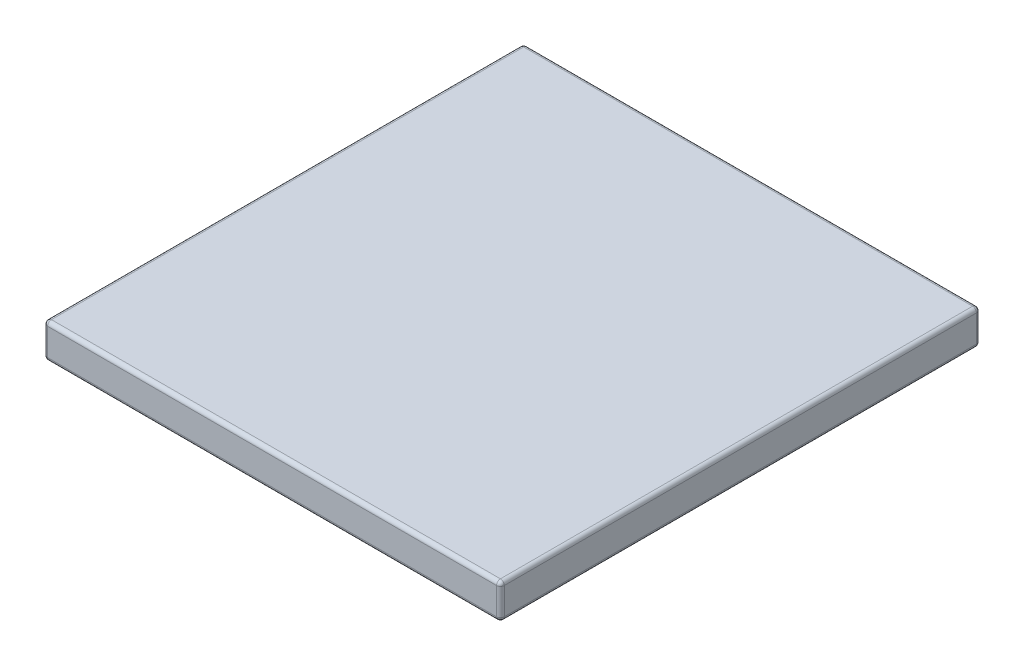
ISO-10303-21;
HEADER;
FILE_DESCRIPTION(('STEP AP214'),'2;1');
FILE_NAME('part.step','',(''),(''),'','','');
FILE_SCHEMA(('AUTOMOTIVE_DESIGN { 1 0 10303 214 1 1 1 1 }'));
ENDSEC;
DATA;
#1=APPLICATION_CONTEXT('core data for automotive mechanical design processes');
#2=APPLICATION_PROTOCOL_DEFINITION('international standard','automotive_design',2000,#1);
#3=PRODUCT_CONTEXT('',#1,'mechanical');
#4=PRODUCT('Part','Part','',(#3));
#5=PRODUCT_RELATED_PRODUCT_CATEGORY('part','',(#4));
#6=PRODUCT_DEFINITION_FORMATION('','',#4);
#7=PRODUCT_DEFINITION_CONTEXT('part definition',#1,'design');
#8=PRODUCT_DEFINITION('design','',#6,#7);
#9=PRODUCT_DEFINITION_SHAPE('','',#8);
#10=(LENGTH_UNIT() NAMED_UNIT(*) SI_UNIT(.MILLI.,.METRE.));
#11=(NAMED_UNIT(*) PLANE_ANGLE_UNIT() SI_UNIT($,.RADIAN.));
#12=(NAMED_UNIT(*) SI_UNIT($,.STERADIAN.) SOLID_ANGLE_UNIT());
#13=UNCERTAINTY_MEASURE_WITH_UNIT(LENGTH_MEASURE(1.E-05),#10,'distance_accuracy_value','');
#14=(GEOMETRIC_REPRESENTATION_CONTEXT(3) GLOBAL_UNCERTAINTY_ASSIGNED_CONTEXT((#13)) GLOBAL_UNIT_ASSIGNED_CONTEXT((#10,
#11,#12)) REPRESENTATION_CONTEXT('',''));
#15=CARTESIAN_POINT('',(0.,0.,0.));
#16=DIRECTION('',(0.,0.,1.));
#17=DIRECTION('',(1.,0.,0.));
#18=AXIS2_PLACEMENT_3D('',#15,#16,#17);
#19=CARTESIAN_POINT('',(-29.55,-4.5,-31.05));
#20=DIRECTION('',(-1.,0.,0.));
#21=DIRECTION('',(0.,0.,1.));
#22=AXIS2_PLACEMENT_3D('',#19,#20,#21);
#23=PLANE('',#22);
#24=DIRECTION('',(0.,1.,0.));
#25=VECTOR('',#24,1.);
#26=CARTESIAN_POINT('',(-29.55,-4.5,-30.55));
#27=LINE('',#26,#25);
#28=CARTESIAN_POINT('',(-29.55,-0.5,-30.55));
#29=VERTEX_POINT('',#28);
#30=CARTESIAN_POINT('',(-29.55,-4.,-30.55));
#31=VERTEX_POINT('',#30);
#32=EDGE_CURVE('E149',#29,#31,#27,.F.);
#33=ORIENTED_EDGE('',*,*,#32,.T.);
#34=DIRECTION('',(0.,0.,1.));
#35=VECTOR('',#34,1.);
#36=CARTESIAN_POINT('',(-29.55,-4.,31.05));
#37=LINE('',#36,#35);
#38=CARTESIAN_POINT('',(-29.55,-4.,30.55));
#39=VERTEX_POINT('',#38);
#40=EDGE_CURVE('E152',#31,#39,#37,.T.);
#41=ORIENTED_EDGE('',*,*,#40,.T.);
#42=DIRECTION('',(0.,1.,0.));
#43=VECTOR('',#42,1.);
#44=CARTESIAN_POINT('',(-29.55,-4.5,30.55));
#45=LINE('',#44,#43);
#46=CARTESIAN_POINT('',(-29.55,-0.5,30.55));
#47=VERTEX_POINT('',#46);
#48=EDGE_CURVE('E126',#39,#47,#45,.T.);
#49=ORIENTED_EDGE('',*,*,#48,.T.);
#50=DIRECTION('',(0.,0.,1.));
#51=VECTOR('',#50,1.);
#52=CARTESIAN_POINT('',(-29.55,-0.5,-31.05));
#53=LINE('',#52,#51);
#54=EDGE_CURVE('E143',#47,#29,#53,.F.);
#55=ORIENTED_EDGE('',*,*,#54,.T.);
#56=EDGE_LOOP('',(#33,#41,#49,#55));
#57=FACE_BOUND('',#56,.T.);
#58=ADVANCED_FACE('F33',(#57),#23,.T.);
#59=CARTESIAN_POINT('',(-29.55,-4.5,-31.05));
#60=DIRECTION('',(0.,0.,-1.));
#61=DIRECTION('',(-1.,0.,0.));
#62=AXIS2_PLACEMENT_3D('',#59,#60,#61);
#63=PLANE('',#62);
#64=DIRECTION('',(0.,1.,0.));
#65=VECTOR('',#64,1.);
#66=CARTESIAN_POINT('',(29.05,-4.5,-31.05));
#67=LINE('',#66,#65);
#68=CARTESIAN_POINT('',(29.05,-0.5,-31.05));
#69=VERTEX_POINT('',#68);
#70=CARTESIAN_POINT('',(29.05,-4.,-31.05));
#71=VERTEX_POINT('',#70);
#72=EDGE_CURVE('E167',#69,#71,#67,.F.);
#73=ORIENTED_EDGE('',*,*,#72,.T.);
#74=DIRECTION('',(-1.,0.,0.));
#75=VECTOR('',#74,1.);
#76=CARTESIAN_POINT('',(-29.55,-4.,-31.05));
#77=LINE('',#76,#75);
#78=CARTESIAN_POINT('',(-29.05,-4.,-31.05));
#79=VERTEX_POINT('',#78);
#80=EDGE_CURVE('E172',#71,#79,#77,.T.);
#81=ORIENTED_EDGE('',*,*,#80,.T.);
#82=DIRECTION('',(0.,1.,0.));
#83=VECTOR('',#82,1.);
#84=CARTESIAN_POINT('',(-29.05,-4.5,-31.05));
#85=LINE('',#84,#83);
#86=CARTESIAN_POINT('',(-29.05,-0.5,-31.05));
#87=VERTEX_POINT('',#86);
#88=EDGE_CURVE('E169',#79,#87,#85,.T.);
#89=ORIENTED_EDGE('',*,*,#88,.T.);
#90=DIRECTION('',(-1.,0.,0.));
#91=VECTOR('',#90,1.);
#92=CARTESIAN_POINT('',(-29.55,-0.5,-31.05));
#93=LINE('',#92,#91);
#94=EDGE_CURVE('E165',#87,#69,#93,.F.);
#95=ORIENTED_EDGE('',*,*,#94,.T.);
#96=EDGE_LOOP('',(#73,#81,#89,#95));
#97=FACE_BOUND('',#96,.T.);
#98=ADVANCED_FACE('F278',(#97),#63,.T.);
#99=CARTESIAN_POINT('',(29.55,-4.5,-31.05));
#100=DIRECTION('',(1.,0.,0.));
#101=DIRECTION('',(0.,0.,-1.));
#102=AXIS2_PLACEMENT_3D('',#99,#100,#101);
#103=PLANE('',#102);
#104=DIRECTION('',(0.,1.,0.));
#105=VECTOR('',#104,1.);
#106=CARTESIAN_POINT('',(29.55,-4.5,30.55));
#107=LINE('',#106,#105);
#108=CARTESIAN_POINT('',(29.55,-0.5,30.55));
#109=VERTEX_POINT('',#108);
#110=CARTESIAN_POINT('',(29.55,-4.,30.55));
#111=VERTEX_POINT('',#110);
#112=EDGE_CURVE('E176',#109,#111,#107,.F.);
#113=ORIENTED_EDGE('',*,*,#112,.T.);
#114=DIRECTION('',(0.,0.,-1.));
#115=VECTOR('',#114,1.);
#116=CARTESIAN_POINT('',(29.55,-4.,-31.05));
#117=LINE('',#116,#115);
#118=CARTESIAN_POINT('',(29.55,-4.,-30.55));
#119=VERTEX_POINT('',#118);
#120=EDGE_CURVE('E181',#111,#119,#117,.T.);
#121=ORIENTED_EDGE('',*,*,#120,.T.);
#122=DIRECTION('',(0.,1.,0.));
#123=VECTOR('',#122,1.);
#124=CARTESIAN_POINT('',(29.55,-4.5,-30.55));
#125=LINE('',#124,#123);
#126=CARTESIAN_POINT('',(29.55,-0.5,-30.55));
#127=VERTEX_POINT('',#126);
#128=EDGE_CURVE('E178',#119,#127,#125,.T.);
#129=ORIENTED_EDGE('',*,*,#128,.T.);
#130=DIRECTION('',(0.,0.,-1.));
#131=VECTOR('',#130,1.);
#132=CARTESIAN_POINT('',(29.55,-0.5,-31.05));
#133=LINE('',#132,#131);
#134=EDGE_CURVE('E174',#127,#109,#133,.F.);
#135=ORIENTED_EDGE('',*,*,#134,.T.);
#136=EDGE_LOOP('',(#113,#121,#129,#135));
#137=FACE_BOUND('',#136,.T.);
#138=ADVANCED_FACE('F291',(#137),#103,.T.);
#139=CARTESIAN_POINT('',(-29.55,-4.5,31.05));
#140=DIRECTION('',(0.,0.,1.));
#141=DIRECTION('',(1.,0.,0.));
#142=AXIS2_PLACEMENT_3D('',#139,#140,#141);
#143=PLANE('',#142);
#144=DIRECTION('',(0.,1.,0.));
#145=VECTOR('',#144,1.);
#146=CARTESIAN_POINT('',(-29.05,-4.5,31.05));
#147=LINE('',#146,#145);
#148=CARTESIAN_POINT('',(-29.05,-0.5,31.05));
#149=VERTEX_POINT('',#148);
#150=CARTESIAN_POINT('',(-29.05,-4.,31.05));
#151=VERTEX_POINT('',#150);
#152=EDGE_CURVE('E128',#149,#151,#147,.F.);
#153=ORIENTED_EDGE('',*,*,#152,.T.);
#154=DIRECTION('',(1.,0.,0.));
#155=VECTOR('',#154,1.);
#156=CARTESIAN_POINT('',(29.55,-4.,31.05));
#157=LINE('',#156,#155);
#158=CARTESIAN_POINT('',(29.05,-4.,31.05));
#159=VERTEX_POINT('',#158);
#160=EDGE_CURVE('E163',#151,#159,#157,.T.);
#161=ORIENTED_EDGE('',*,*,#160,.T.);
#162=DIRECTION('',(0.,1.,0.));
#163=VECTOR('',#162,1.);
#164=CARTESIAN_POINT('',(29.05,-4.5,31.05));
#165=LINE('',#164,#163);
#166=CARTESIAN_POINT('',(29.05,-0.5,31.05));
#167=VERTEX_POINT('',#166);
#168=EDGE_CURVE('E160',#159,#167,#165,.T.);
#169=ORIENTED_EDGE('',*,*,#168,.T.);
#170=DIRECTION('',(1.,0.,0.));
#171=VECTOR('',#170,1.);
#172=CARTESIAN_POINT('',(-29.55,-0.5,31.05));
#173=LINE('',#172,#171);
#174=EDGE_CURVE('E155',#167,#149,#173,.F.);
#175=ORIENTED_EDGE('',*,*,#174,.T.);
#176=EDGE_LOOP('',(#153,#161,#169,#175));
#177=FACE_BOUND('',#176,.T.);
#178=ADVANCED_FACE('F307',(#177),#143,.T.);
#179=CARTESIAN_POINT('',(0.,-4.5,0.));
#180=DIRECTION('',(0.,1.,0.));
#181=DIRECTION('',(0.,0.,1.));
#182=AXIS2_PLACEMENT_3D('',#179,#180,#181);
#183=PLANE('',#182);
#184=DIRECTION('',(0.,0.,-1.));
#185=VECTOR('',#184,1.);
#186=CARTESIAN_POINT('',(29.05,-4.5,31.05));
#187=LINE('',#186,#185);
#188=CARTESIAN_POINT('',(29.05,-4.5,-30.55));
#189=VERTEX_POINT('',#188);
#190=CARTESIAN_POINT('',(29.05,-4.5,30.55));
#191=VERTEX_POINT('',#190);
#192=EDGE_CURVE('E187',#189,#191,#187,.F.);
#193=ORIENTED_EDGE('',*,*,#192,.T.);
#194=DIRECTION('',(1.,0.,0.));
#195=VECTOR('',#194,1.);
#196=CARTESIAN_POINT('',(-29.55,-4.5,30.55));
#197=LINE('',#196,#195);
#198=CARTESIAN_POINT('',(-29.05,-4.5,30.55));
#199=VERTEX_POINT('',#198);
#200=EDGE_CURVE('E189',#191,#199,#197,.F.);
#201=ORIENTED_EDGE('',*,*,#200,.T.);
#202=DIRECTION('',(0.,0.,1.));
#203=VECTOR('',#202,1.);
#204=CARTESIAN_POINT('',(-29.05,-4.5,-31.05));
#205=LINE('',#204,#203);
#206=CARTESIAN_POINT('',(-29.05,-4.5,-30.55));
#207=VERTEX_POINT('',#206);
#208=EDGE_CURVE('E183',#199,#207,#205,.F.);
#209=ORIENTED_EDGE('',*,*,#208,.T.);
#210=DIRECTION('',(-1.,0.,0.));
#211=VECTOR('',#210,1.);
#212=CARTESIAN_POINT('',(29.55,-4.5,-30.55));
#213=LINE('',#212,#211);
#214=EDGE_CURVE('E185',#207,#189,#213,.F.);
#215=ORIENTED_EDGE('',*,*,#214,.T.);
#216=EDGE_LOOP('',(#193,#201,#209,#215));
#217=FACE_BOUND('',#216,.T.);
#218=ADVANCED_FACE('F269',(#217),#183,.F.);
#219=CARTESIAN_POINT('',(0.,0.,0.));
#220=DIRECTION('',(0.,1.,0.));
#221=DIRECTION('',(0.,0.,1.));
#222=AXIS2_PLACEMENT_3D('',#219,#220,#221);
#223=PLANE('',#222);
#224=DIRECTION('',(0.,0.,-1.));
#225=VECTOR('',#224,1.);
#226=CARTESIAN_POINT('',(29.05,0.,0.));
#227=LINE('',#226,#225);
#228=CARTESIAN_POINT('',(29.05,0.,30.55));
#229=VERTEX_POINT('',#228);
#230=CARTESIAN_POINT('',(29.05,0.,-30.55));
#231=VERTEX_POINT('',#230);
#232=EDGE_CURVE('E42',#229,#231,#227,.T.);
#233=ORIENTED_EDGE('',*,*,#232,.T.);
#234=DIRECTION('',(-1.,0.,0.));
#235=VECTOR('',#234,1.);
#236=CARTESIAN_POINT('',(0.,0.,-30.55));
#237=LINE('',#236,#235);
#238=CARTESIAN_POINT('',(-29.05,0.,-30.55));
#239=VERTEX_POINT('',#238);
#240=EDGE_CURVE('E11',#231,#239,#237,.T.);
#241=ORIENTED_EDGE('',*,*,#240,.T.);
#242=DIRECTION('',(0.,0.,1.));
#243=VECTOR('',#242,1.);
#244=CARTESIAN_POINT('',(-29.05,0.,0.));
#245=LINE('',#244,#243);
#246=CARTESIAN_POINT('',(-29.05,0.,30.55));
#247=VERTEX_POINT('',#246);
#248=EDGE_CURVE('E192',#239,#247,#245,.T.);
#249=ORIENTED_EDGE('',*,*,#248,.T.);
#250=DIRECTION('',(1.,0.,0.));
#251=VECTOR('',#250,1.);
#252=CARTESIAN_POINT('',(0.,0.,30.55));
#253=LINE('',#252,#251);
#254=EDGE_CURVE('E53',#247,#229,#253,.T.);
#255=ORIENTED_EDGE('',*,*,#254,.T.);
#256=EDGE_LOOP('',(#233,#241,#249,#255));
#257=FACE_BOUND('',#256,.T.);
#258=ADVANCED_FACE('F479',(#257),#223,.T.);
#259=CARTESIAN_POINT('',(29.05,-4.5,-30.55));
#260=DIRECTION('',(0.,1.,0.));
#261=DIRECTION('',(0.,0.,1.));
#262=AXIS2_PLACEMENT_3D('',#259,#260,#261);
#263=CYLINDRICAL_SURFACE('',#262,0.5);
#264=CARTESIAN_POINT('',(29.05,-4.,-30.55));
#265=DIRECTION('',(0.,-1.,0.));
#266=DIRECTION('',(0.,0.,-1.));
#267=AXIS2_PLACEMENT_3D('',#264,#265,#266);
#268=CIRCLE('',#267,0.5);
#269=EDGE_CURVE('E37',#71,#119,#268,.T.);
#270=ORIENTED_EDGE('',*,*,#269,.F.);
#271=ORIENTED_EDGE('',*,*,#72,.F.);
#272=CARTESIAN_POINT('',(29.05,-0.5,-30.55));
#273=DIRECTION('',(0.,1.,0.));
#274=DIRECTION('',(0.,0.,1.));
#275=AXIS2_PLACEMENT_3D('',#272,#273,#274);
#276=CIRCLE('',#275,0.5);
#277=EDGE_CURVE('E245',#127,#69,#276,.T.);
#278=ORIENTED_EDGE('',*,*,#277,.F.);
#279=ORIENTED_EDGE('',*,*,#128,.F.);
#280=EDGE_LOOP('',(#270,#271,#278,#279));
#281=FACE_BOUND('',#280,.T.);
#282=ADVANCED_FACE('F35',(#281),#263,.T.);
#283=CARTESIAN_POINT('',(29.05,-4.,-30.55));
#284=DIRECTION('',(0.,0.,1.));
#285=DIRECTION('',(1.,0.,0.));
#286=AXIS2_PLACEMENT_3D('',#283,#284,#285);
#287=SPHERICAL_SURFACE('',#286,0.5);
#288=CARTESIAN_POINT('',(29.05,-4.,-30.55));
#289=DIRECTION('',(1.,0.,0.));
#290=DIRECTION('',(0.,0.,-1.));
#291=AXIS2_PLACEMENT_3D('',#288,#289,#290);
#292=CIRCLE('',#291,0.5);
#293=EDGE_CURVE('E240',#71,#189,#292,.F.);
#294=ORIENTED_EDGE('',*,*,#293,.F.);
#295=ORIENTED_EDGE('',*,*,#269,.T.);
#296=CARTESIAN_POINT('',(29.05,-4.,-30.55));
#297=DIRECTION('',(0.,0.,-1.));
#298=DIRECTION('',(-1.,0.,0.));
#299=AXIS2_PLACEMENT_3D('',#296,#297,#298);
#300=CIRCLE('',#299,0.5);
#301=EDGE_CURVE('E243',#189,#119,#300,.F.);
#302=ORIENTED_EDGE('',*,*,#301,.F.);
#303=EDGE_LOOP('',(#294,#295,#302));
#304=FACE_BOUND('',#303,.T.);
#305=ADVANCED_FACE('F256',(#304),#287,.T.);
#306=CARTESIAN_POINT('',(29.05,-0.5,-30.55));
#307=DIRECTION('',(0.,0.,1.));
#308=DIRECTION('',(1.,0.,0.));
#309=AXIS2_PLACEMENT_3D('',#306,#307,#308);
#310=SPHERICAL_SURFACE('',#309,0.5);
#311=CARTESIAN_POINT('',(29.05,-0.5,-30.55));
#312=DIRECTION('',(0.,0.,-1.));
#313=DIRECTION('',(-1.,0.,0.));
#314=AXIS2_PLACEMENT_3D('',#311,#312,#313);
#315=CIRCLE('',#314,0.5);
#316=EDGE_CURVE('E235',#127,#231,#315,.F.);
#317=ORIENTED_EDGE('',*,*,#316,.F.);
#318=ORIENTED_EDGE('',*,*,#277,.T.);
#319=CARTESIAN_POINT('',(29.05,-0.5,-30.55));
#320=DIRECTION('',(1.,0.,0.));
#321=DIRECTION('',(0.,1.,0.));
#322=AXIS2_PLACEMENT_3D('',#319,#320,#321);
#323=CIRCLE('',#322,0.5);
#324=EDGE_CURVE('E237',#231,#69,#323,.F.);
#325=ORIENTED_EDGE('',*,*,#324,.F.);
#326=EDGE_LOOP('',(#317,#318,#325));
#327=FACE_BOUND('',#326,.T.);
#328=ADVANCED_FACE('F458',(#327),#310,.T.);
#329=CARTESIAN_POINT('',(29.05,-4.,-31.05));
#330=DIRECTION('',(0.,0.,1.));
#331=DIRECTION('',(1.,0.,0.));
#332=AXIS2_PLACEMENT_3D('',#329,#330,#331);
#333=CYLINDRICAL_SURFACE('',#332,0.5);
#334=ORIENTED_EDGE('',*,*,#301,.T.);
#335=ORIENTED_EDGE('',*,*,#120,.F.);
#336=CARTESIAN_POINT('',(29.05,-4.,30.55));
#337=DIRECTION('',(0.,0.,1.));
#338=DIRECTION('',(1.,0.,0.));
#339=AXIS2_PLACEMENT_3D('',#336,#337,#338);
#340=CIRCLE('',#339,0.5);
#341=EDGE_CURVE('E229',#191,#111,#340,.T.);
#342=ORIENTED_EDGE('',*,*,#341,.F.);
#343=ORIENTED_EDGE('',*,*,#192,.F.);
#344=EDGE_LOOP('',(#334,#335,#342,#343));
#345=FACE_BOUND('',#344,.T.);
#346=ADVANCED_FACE('F264',(#345),#333,.T.);
#347=CARTESIAN_POINT('',(-29.55,-4.,-30.55));
#348=DIRECTION('',(1.,0.,0.));
#349=DIRECTION('',(0.,0.,-1.));
#350=AXIS2_PLACEMENT_3D('',#347,#348,#349);
#351=CYLINDRICAL_SURFACE('',#350,0.5);
#352=ORIENTED_EDGE('',*,*,#293,.T.);
#353=ORIENTED_EDGE('',*,*,#214,.F.);
#354=CARTESIAN_POINT('',(-29.05,-4.,-30.55));
#355=DIRECTION('',(-1.,0.,0.));
#356=DIRECTION('',(0.,0.,1.));
#357=AXIS2_PLACEMENT_3D('',#354,#355,#356);
#358=CIRCLE('',#357,0.5);
#359=EDGE_CURVE('E226',#79,#207,#358,.T.);
#360=ORIENTED_EDGE('',*,*,#359,.F.);
#361=ORIENTED_EDGE('',*,*,#80,.F.);
#362=EDGE_LOOP('',(#352,#353,#360,#361));
#363=FACE_BOUND('',#362,.T.);
#364=ADVANCED_FACE('F275',(#363),#351,.T.);
#365=CARTESIAN_POINT('',(-29.05,-4.5,-30.55));
#366=DIRECTION('',(0.,1.,0.));
#367=DIRECTION('',(0.,0.,1.));
#368=AXIS2_PLACEMENT_3D('',#365,#366,#367);
#369=CYLINDRICAL_SURFACE('',#368,0.5);
#370=CARTESIAN_POINT('',(-29.05,-0.5,-30.55));
#371=DIRECTION('',(0.,1.,0.));
#372=DIRECTION('',(0.,0.,1.));
#373=AXIS2_PLACEMENT_3D('',#370,#371,#372);
#374=CIRCLE('',#373,0.5);
#375=EDGE_CURVE('E220',#87,#29,#374,.T.);
#376=ORIENTED_EDGE('',*,*,#375,.F.);
#377=ORIENTED_EDGE('',*,*,#88,.F.);
#378=CARTESIAN_POINT('',(-29.05,-4.,-30.55));
#379=DIRECTION('',(0.,-1.,0.));
#380=DIRECTION('',(0.,0.,-1.));
#381=AXIS2_PLACEMENT_3D('',#378,#379,#380);
#382=CIRCLE('',#381,0.5);
#383=EDGE_CURVE('E223',#31,#79,#382,.T.);
#384=ORIENTED_EDGE('',*,*,#383,.F.);
#385=ORIENTED_EDGE('',*,*,#32,.F.);
#386=EDGE_LOOP('',(#376,#377,#384,#385));
#387=FACE_BOUND('',#386,.T.);
#388=ADVANCED_FACE('F282',(#387),#369,.T.);
#389=CARTESIAN_POINT('',(0.,-0.5,-30.55));
#390=DIRECTION('',(-1.,0.,0.));
#391=DIRECTION('',(0.,0.,1.));
#392=AXIS2_PLACEMENT_3D('',#389,#390,#391);
#393=CYLINDRICAL_SURFACE('',#392,0.5);
#394=ORIENTED_EDGE('',*,*,#324,.T.);
#395=ORIENTED_EDGE('',*,*,#94,.F.);
#396=CARTESIAN_POINT('',(-29.05,-0.5,-30.55));
#397=DIRECTION('',(-1.,0.,0.));
#398=DIRECTION('',(0.,0.,1.));
#399=AXIS2_PLACEMENT_3D('',#396,#397,#398);
#400=CIRCLE('',#399,0.5);
#401=EDGE_CURVE('E218',#239,#87,#400,.T.);
#402=ORIENTED_EDGE('',*,*,#401,.F.);
#403=ORIENTED_EDGE('',*,*,#240,.F.);
#404=EDGE_LOOP('',(#394,#395,#402,#403));
#405=FACE_BOUND('',#404,.T.);
#406=ADVANCED_FACE('F288',(#405),#393,.T.);
#407=CARTESIAN_POINT('',(29.05,-0.5,0.));
#408=DIRECTION('',(0.,0.,-1.));
#409=DIRECTION('',(-1.,0.,0.));
#410=AXIS2_PLACEMENT_3D('',#407,#408,#409);
#411=CYLINDRICAL_SURFACE('',#410,0.5);
#412=ORIENTED_EDGE('',*,*,#316,.T.);
#413=ORIENTED_EDGE('',*,*,#232,.F.);
#414=CARTESIAN_POINT('',(29.05,-0.5,30.55));
#415=DIRECTION('',(0.,0.,1.));
#416=DIRECTION('',(1.,0.,0.));
#417=AXIS2_PLACEMENT_3D('',#414,#415,#416);
#418=CIRCLE('',#417,0.5);
#419=EDGE_CURVE('E215',#109,#229,#418,.T.);
#420=ORIENTED_EDGE('',*,*,#419,.F.);
#421=ORIENTED_EDGE('',*,*,#134,.F.);
#422=EDGE_LOOP('',(#412,#413,#420,#421));
#423=FACE_BOUND('',#422,.T.);
#424=ADVANCED_FACE('F300',(#423),#411,.T.);
#425=CARTESIAN_POINT('',(29.05,-4.5,30.55));
#426=DIRECTION('',(0.,1.,0.));
#427=DIRECTION('',(0.,0.,1.));
#428=AXIS2_PLACEMENT_3D('',#425,#426,#427);
#429=CYLINDRICAL_SURFACE('',#428,0.5);
#430=CARTESIAN_POINT('',(29.05,-4.,30.55));
#431=DIRECTION('',(0.,-1.,0.));
#432=DIRECTION('',(0.,0.,-1.));
#433=AXIS2_PLACEMENT_3D('',#430,#431,#432);
#434=CIRCLE('',#433,0.5);
#435=EDGE_CURVE('E232',#111,#159,#434,.T.);
#436=ORIENTED_EDGE('',*,*,#435,.F.);
#437=ORIENTED_EDGE('',*,*,#112,.F.);
#438=CARTESIAN_POINT('',(29.05,-0.5,30.55));
#439=DIRECTION('',(0.,1.,0.));
#440=DIRECTION('',(0.,0.,1.));
#441=AXIS2_PLACEMENT_3D('',#438,#439,#440);
#442=CIRCLE('',#441,0.5);
#443=EDGE_CURVE('E212',#167,#109,#442,.T.);
#444=ORIENTED_EDGE('',*,*,#443,.F.);
#445=ORIENTED_EDGE('',*,*,#168,.F.);
#446=EDGE_LOOP('',(#436,#437,#444,#445));
#447=FACE_BOUND('',#446,.T.);
#448=ADVANCED_FACE('F296',(#447),#429,.T.);
#449=CARTESIAN_POINT('',(29.05,-4.,30.55));
#450=DIRECTION('',(0.,0.,1.));
#451=DIRECTION('',(1.,0.,0.));
#452=AXIS2_PLACEMENT_3D('',#449,#450,#451);
#453=SPHERICAL_SURFACE('',#452,0.5);
#454=ORIENTED_EDGE('',*,*,#341,.T.);
#455=ORIENTED_EDGE('',*,*,#435,.T.);
#456=CARTESIAN_POINT('',(29.05,-4.,30.55));
#457=DIRECTION('',(1.,0.,0.));
#458=DIRECTION('',(0.,0.,-1.));
#459=AXIS2_PLACEMENT_3D('',#456,#457,#458);
#460=CIRCLE('',#459,0.5);
#461=EDGE_CURVE('E209',#191,#159,#460,.F.);
#462=ORIENTED_EDGE('',*,*,#461,.F.);
#463=EDGE_LOOP('',(#454,#455,#462));
#464=FACE_BOUND('',#463,.T.);
#465=ADVANCED_FACE('F310',(#464),#453,.T.);
#466=CARTESIAN_POINT('',(-29.05,-4.,-30.55));
#467=DIRECTION('',(0.,0.,1.));
#468=DIRECTION('',(1.,0.,0.));
#469=AXIS2_PLACEMENT_3D('',#466,#467,#468);
#470=SPHERICAL_SURFACE('',#469,0.5);
#471=ORIENTED_EDGE('',*,*,#383,.T.);
#472=ORIENTED_EDGE('',*,*,#359,.T.);
#473=CARTESIAN_POINT('',(-29.05,-4.,-30.55));
#474=DIRECTION('',(0.,0.,-1.));
#475=DIRECTION('',(-1.,0.,0.));
#476=AXIS2_PLACEMENT_3D('',#473,#474,#475);
#477=CIRCLE('',#476,0.5);
#478=EDGE_CURVE('E206',#31,#207,#477,.F.);
#479=ORIENTED_EDGE('',*,*,#478,.F.);
#480=EDGE_LOOP('',(#471,#472,#479));
#481=FACE_BOUND('',#480,.T.);
#482=ADVANCED_FACE('F319',(#481),#470,.T.);
#483=CARTESIAN_POINT('',(-29.05,-0.5,-30.55));
#484=DIRECTION('',(0.,0.,1.));
#485=DIRECTION('',(1.,0.,0.));
#486=AXIS2_PLACEMENT_3D('',#483,#484,#485);
#487=SPHERICAL_SURFACE('',#486,0.5);
#488=ORIENTED_EDGE('',*,*,#401,.T.);
#489=ORIENTED_EDGE('',*,*,#375,.T.);
#490=CARTESIAN_POINT('',(-29.05,-0.5,-30.55));
#491=DIRECTION('',(0.,0.,-1.));
#492=DIRECTION('',(0.,1.,0.));
#493=AXIS2_PLACEMENT_3D('',#490,#491,#492);
#494=CIRCLE('',#493,0.5);
#495=EDGE_CURVE('E146',#239,#29,#494,.F.);
#496=ORIENTED_EDGE('',*,*,#495,.F.);
#497=EDGE_LOOP('',(#488,#489,#496));
#498=FACE_BOUND('',#497,.T.);
#499=ADVANCED_FACE('F321',(#498),#487,.T.);
#500=CARTESIAN_POINT('',(29.05,-0.5,30.55));
#501=DIRECTION('',(0.,0.,1.));
#502=DIRECTION('',(1.,0.,0.));
#503=AXIS2_PLACEMENT_3D('',#500,#501,#502);
#504=SPHERICAL_SURFACE('',#503,0.5);
#505=ORIENTED_EDGE('',*,*,#443,.T.);
#506=ORIENTED_EDGE('',*,*,#419,.T.);
#507=CARTESIAN_POINT('',(29.05,-0.5,30.55));
#508=DIRECTION('',(1.,0.,0.));
#509=DIRECTION('',(0.,0.,-1.));
#510=AXIS2_PLACEMENT_3D('',#507,#508,#509);
#511=CIRCLE('',#510,0.5);
#512=EDGE_CURVE('E202',#167,#229,#511,.F.);
#513=ORIENTED_EDGE('',*,*,#512,.F.);
#514=EDGE_LOOP('',(#505,#506,#513));
#515=FACE_BOUND('',#514,.T.);
#516=ADVANCED_FACE('F302',(#515),#504,.T.);
#517=CARTESIAN_POINT('',(-29.55,-4.,30.55));
#518=DIRECTION('',(-1.,0.,0.));
#519=DIRECTION('',(0.,0.,1.));
#520=AXIS2_PLACEMENT_3D('',#517,#518,#519);
#521=CYLINDRICAL_SURFACE('',#520,0.5);
#522=ORIENTED_EDGE('',*,*,#461,.T.);
#523=ORIENTED_EDGE('',*,*,#160,.F.);
#524=CARTESIAN_POINT('',(-29.05,-4.,30.55));
#525=DIRECTION('',(-1.,0.,0.));
#526=DIRECTION('',(0.,0.,1.));
#527=AXIS2_PLACEMENT_3D('',#524,#525,#526);
#528=CIRCLE('',#527,0.5);
#529=EDGE_CURVE('E199',#199,#151,#528,.T.);
#530=ORIENTED_EDGE('',*,*,#529,.F.);
#531=ORIENTED_EDGE('',*,*,#200,.F.);
#532=EDGE_LOOP('',(#522,#523,#530,#531));
#533=FACE_BOUND('',#532,.T.);
#534=ADVANCED_FACE('F312',(#533),#521,.T.);
#535=CARTESIAN_POINT('',(-29.05,-4.,-31.05));
#536=DIRECTION('',(0.,0.,-1.));
#537=DIRECTION('',(-1.,0.,0.));
#538=AXIS2_PLACEMENT_3D('',#535,#536,#537);
#539=CYLINDRICAL_SURFACE('',#538,0.5);
#540=ORIENTED_EDGE('',*,*,#478,.T.);
#541=ORIENTED_EDGE('',*,*,#208,.F.);
#542=CARTESIAN_POINT('',(-29.05,-4.,30.55));
#543=DIRECTION('',(0.,0.,1.));
#544=DIRECTION('',(0.,-1.,0.));
#545=AXIS2_PLACEMENT_3D('',#542,#543,#544);
#546=CIRCLE('',#545,0.5);
#547=EDGE_CURVE('E140',#39,#199,#546,.T.);
#548=ORIENTED_EDGE('',*,*,#547,.F.);
#549=ORIENTED_EDGE('',*,*,#40,.F.);
#550=EDGE_LOOP('',(#540,#541,#548,#549));
#551=FACE_BOUND('',#550,.T.);
#552=ADVANCED_FACE('F317',(#551),#539,.T.);
#553=CARTESIAN_POINT('',(-29.05,-0.5,0.));
#554=DIRECTION('',(0.,0.,1.));
#555=DIRECTION('',(1.,0.,0.));
#556=AXIS2_PLACEMENT_3D('',#553,#554,#555);
#557=CYLINDRICAL_SURFACE('',#556,0.5);
#558=ORIENTED_EDGE('',*,*,#495,.T.);
#559=ORIENTED_EDGE('',*,*,#54,.F.);
#560=CARTESIAN_POINT('',(-29.05,-0.5,30.55));
#561=DIRECTION('',(0.,0.,1.));
#562=DIRECTION('',(1.,0.,0.));
#563=AXIS2_PLACEMENT_3D('',#560,#561,#562);
#564=CIRCLE('',#563,0.5);
#565=EDGE_CURVE('E134',#247,#47,#564,.T.);
#566=ORIENTED_EDGE('',*,*,#565,.F.);
#567=ORIENTED_EDGE('',*,*,#248,.F.);
#568=EDGE_LOOP('',(#558,#559,#566,#567));
#569=FACE_BOUND('',#568,.T.);
#570=ADVANCED_FACE('F144',(#569),#557,.T.);
#571=CARTESIAN_POINT('',(0.,-0.5,30.55));
#572=DIRECTION('',(1.,0.,0.));
#573=DIRECTION('',(0.,0.,-1.));
#574=AXIS2_PLACEMENT_3D('',#571,#572,#573);
#575=CYLINDRICAL_SURFACE('',#574,0.5);
#576=ORIENTED_EDGE('',*,*,#512,.T.);
#577=ORIENTED_EDGE('',*,*,#254,.F.);
#578=CARTESIAN_POINT('',(-29.05,-0.5,30.55));
#579=DIRECTION('',(-1.,0.,0.));
#580=DIRECTION('',(0.,0.,1.));
#581=AXIS2_PLACEMENT_3D('',#578,#579,#580);
#582=CIRCLE('',#581,0.5);
#583=EDGE_CURVE('E138',#149,#247,#582,.T.);
#584=ORIENTED_EDGE('',*,*,#583,.F.);
#585=ORIENTED_EDGE('',*,*,#174,.F.);
#586=EDGE_LOOP('',(#576,#577,#584,#585));
#587=FACE_BOUND('',#586,.T.);
#588=ADVANCED_FACE('F305',(#587),#575,.T.);
#589=CARTESIAN_POINT('',(-29.05,-4.,30.55));
#590=DIRECTION('',(0.,0.,1.));
#591=DIRECTION('',(1.,0.,0.));
#592=AXIS2_PLACEMENT_3D('',#589,#590,#591);
#593=SPHERICAL_SURFACE('',#592,0.5);
#594=ORIENTED_EDGE('',*,*,#547,.T.);
#595=ORIENTED_EDGE('',*,*,#529,.T.);
#596=CARTESIAN_POINT('',(-29.05,-4.,30.55));
#597=DIRECTION('',(0.,-1.,0.));
#598=DIRECTION('',(0.,0.,-1.));
#599=AXIS2_PLACEMENT_3D('',#596,#597,#598);
#600=CIRCLE('',#599,0.5);
#601=EDGE_CURVE('E131',#39,#151,#600,.F.);
#602=ORIENTED_EDGE('',*,*,#601,.F.);
#603=EDGE_LOOP('',(#594,#595,#602));
#604=FACE_BOUND('',#603,.T.);
#605=ADVANCED_FACE('F342',(#604),#593,.T.);
#606=CARTESIAN_POINT('',(-29.05,-0.5,30.55));
#607=DIRECTION('',(0.,0.,1.));
#608=DIRECTION('',(1.,0.,0.));
#609=AXIS2_PLACEMENT_3D('',#606,#607,#608);
#610=SPHERICAL_SURFACE('',#609,0.5);
#611=ORIENTED_EDGE('',*,*,#583,.T.);
#612=ORIENTED_EDGE('',*,*,#565,.T.);
#613=CARTESIAN_POINT('',(-29.05,-0.5,30.55));
#614=DIRECTION('',(0.,1.,0.));
#615=DIRECTION('',(0.,0.,1.));
#616=AXIS2_PLACEMENT_3D('',#613,#614,#615);
#617=CIRCLE('',#616,0.5);
#618=EDGE_CURVE('E122',#149,#47,#617,.F.);
#619=ORIENTED_EDGE('',*,*,#618,.F.);
#620=EDGE_LOOP('',(#611,#612,#619));
#621=FACE_BOUND('',#620,.T.);
#622=ADVANCED_FACE('F136',(#621),#610,.T.);
#623=CARTESIAN_POINT('',(-29.05,-4.5,30.55));
#624=DIRECTION('',(0.,1.,0.));
#625=DIRECTION('',(0.,0.,1.));
#626=AXIS2_PLACEMENT_3D('',#623,#624,#625);
#627=CYLINDRICAL_SURFACE('',#626,0.5);
#628=ORIENTED_EDGE('',*,*,#601,.T.);
#629=ORIENTED_EDGE('',*,*,#152,.F.);
#630=ORIENTED_EDGE('',*,*,#618,.T.);
#631=ORIENTED_EDGE('',*,*,#48,.F.);
#632=EDGE_LOOP('',(#628,#629,#630,#631));
#633=FACE_BOUND('',#632,.T.);
#634=ADVANCED_FACE('F124',(#633),#627,.T.);
#635=CLOSED_SHELL('',(#58,#98,#138,#178,#218,#258,#282,#305,#328,#346,#364,#388,#406,#424,#448,
#465,#482,#499,#516,#534,#552,#570,#588,#605,#622,#634));
#636=MANIFOLD_SOLID_BREP('B2',#635);
#637=ADVANCED_BREP_SHAPE_REPRESENTATION('',(#18,#636),#14);
#638=SHAPE_DEFINITION_REPRESENTATION(#9,#637);
ENDSEC;
END-ISO-10303-21;
